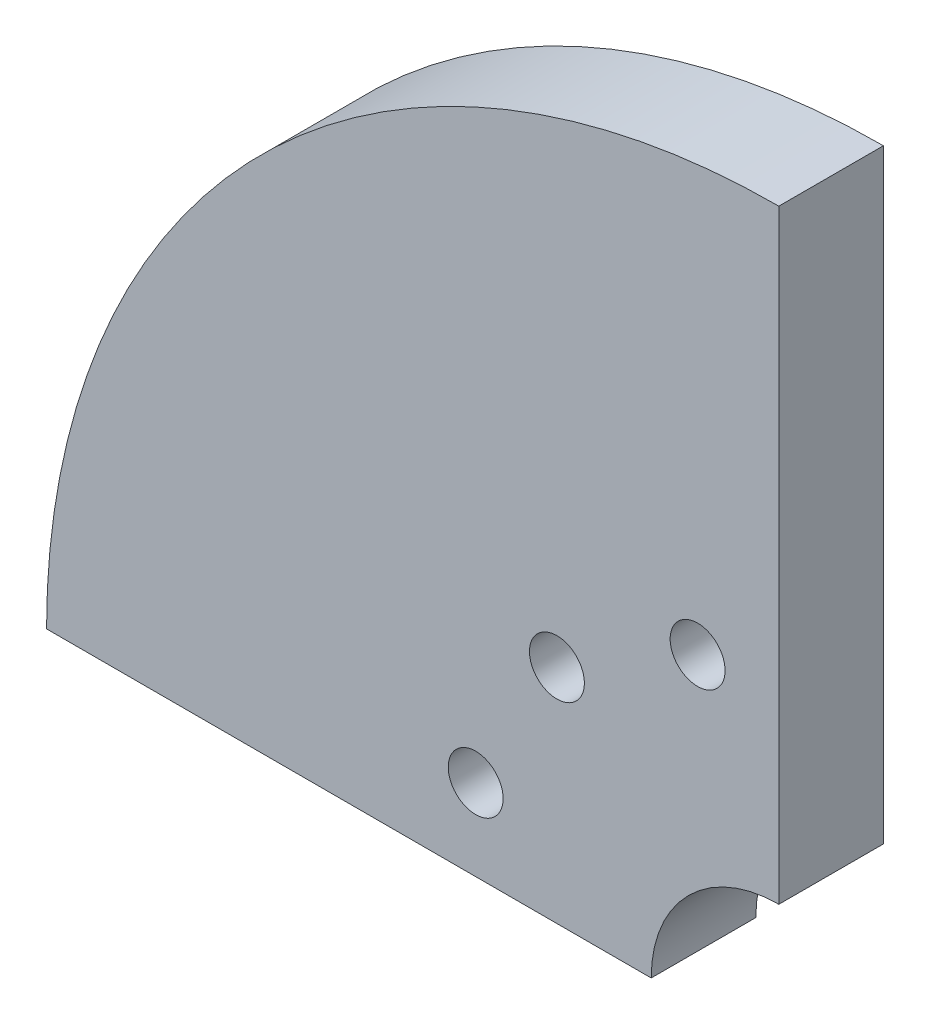
ISO-10303-21;
HEADER;
FILE_DESCRIPTION(('STEP AP214'),'2;1');
FILE_NAME('part.step','',(''),(''),'','','');
FILE_SCHEMA(('AUTOMOTIVE_DESIGN { 1 0 10303 214 1 1 1 1 }'));
ENDSEC;
DATA;
#1=APPLICATION_CONTEXT('core data for automotive mechanical design processes');
#2=APPLICATION_PROTOCOL_DEFINITION('international standard','automotive_design',2000,#1);
#3=PRODUCT_CONTEXT('',#1,'mechanical');
#4=PRODUCT('Part','Part','',(#3));
#5=PRODUCT_RELATED_PRODUCT_CATEGORY('part','',(#4));
#6=PRODUCT_DEFINITION_FORMATION('','',#4);
#7=PRODUCT_DEFINITION_CONTEXT('part definition',#1,'design');
#8=PRODUCT_DEFINITION('design','',#6,#7);
#9=PRODUCT_DEFINITION_SHAPE('','',#8);
#10=(LENGTH_UNIT() NAMED_UNIT(*) SI_UNIT(.MILLI.,.METRE.));
#11=(NAMED_UNIT(*) PLANE_ANGLE_UNIT() SI_UNIT($,.RADIAN.));
#12=(NAMED_UNIT(*) SI_UNIT($,.STERADIAN.) SOLID_ANGLE_UNIT());
#13=UNCERTAINTY_MEASURE_WITH_UNIT(LENGTH_MEASURE(1.E-05),#10,'distance_accuracy_value','');
#14=(GEOMETRIC_REPRESENTATION_CONTEXT(3) GLOBAL_UNCERTAINTY_ASSIGNED_CONTEXT((#13)) GLOBAL_UNIT_ASSIGNED_CONTEXT((#10,
#11,#12)) REPRESENTATION_CONTEXT('',''));
#15=CARTESIAN_POINT('',(0.,0.,0.));
#16=DIRECTION('',(0.,0.,1.));
#17=DIRECTION('',(1.,0.,0.));
#18=AXIS2_PLACEMENT_3D('',#15,#16,#17);
#19=CARTESIAN_POINT('',(0.,0.,10.));
#20=DIRECTION('',(0.,1.,0.));
#21=DIRECTION('',(-1.,0.,0.));
#22=AXIS2_PLACEMENT_3D('',#19,#20,#21);
#23=PLANE('',#22);
#24=DIRECTION('',(0.,0.,-1.));
#25=VECTOR('',#24,1.);
#26=CARTESIAN_POINT('',(-12.2,0.,20.));
#27=LINE('',#26,#25);
#28=CARTESIAN_POINT('',(-12.2,0.,10.));
#29=VERTEX_POINT('',#28);
#30=CARTESIAN_POINT('',(-12.2,0.,0.));
#31=VERTEX_POINT('',#30);
#32=EDGE_CURVE('E297',#29,#31,#27,.T.);
#33=ORIENTED_EDGE('',*,*,#32,.F.);
#34=DIRECTION('',(1.,0.,0.));
#35=VECTOR('',#34,1.);
#36=CARTESIAN_POINT('',(0.,0.,10.));
#37=LINE('',#36,#35);
#38=CARTESIAN_POINT('',(-69.9999999995403,0.,10.));
#39=VERTEX_POINT('',#38);
#40=EDGE_CURVE('E321',#39,#29,#37,.T.);
#41=ORIENTED_EDGE('',*,*,#40,.F.);
#42=DIRECTION('',(0.,0.,-1.));
#43=VECTOR('',#42,1.);
#44=CARTESIAN_POINT('',(-69.9999999995403,0.,10.));
#45=LINE('',#44,#43);
#46=CARTESIAN_POINT('',(-69.9999999995403,0.,0.));
#47=VERTEX_POINT('',#46);
#48=EDGE_CURVE('E12',#39,#47,#45,.T.);
#49=ORIENTED_EDGE('',*,*,#48,.T.);
#50=DIRECTION('',(1.,0.,0.));
#51=VECTOR('',#50,1.);
#52=CARTESIAN_POINT('',(0.,0.,0.));
#53=LINE('',#52,#51);
#54=EDGE_CURVE('E329',#47,#31,#53,.T.);
#55=ORIENTED_EDGE('',*,*,#54,.T.);
#56=EDGE_LOOP('',(#33,#41,#49,#55));
#57=FACE_BOUND('',#56,.T.);
#58=ADVANCED_FACE('F84',(#57),#23,.F.);
#59=CARTESIAN_POINT('',(0.,69.9999999997537,10.));
#60=DIRECTION('',(-1.,0.,0.));
#61=DIRECTION('',(0.,-1.,0.));
#62=AXIS2_PLACEMENT_3D('',#59,#60,#61);
#63=PLANE('',#62);
#64=DIRECTION('',(0.,0.,-1.));
#65=VECTOR('',#64,1.);
#66=CARTESIAN_POINT('',(0.,12.2,20.));
#67=LINE('',#66,#65);
#68=CARTESIAN_POINT('',(0.,12.2,0.));
#69=VERTEX_POINT('',#68);
#70=CARTESIAN_POINT('',(0.,12.2,10.));
#71=VERTEX_POINT('',#70);
#72=EDGE_CURVE('E295',#69,#71,#67,.F.);
#73=ORIENTED_EDGE('',*,*,#72,.F.);
#74=DIRECTION('',(0.,1.,0.));
#75=VECTOR('',#74,1.);
#76=CARTESIAN_POINT('',(0.,69.9999999997537,0.));
#77=LINE('',#76,#75);
#78=CARTESIAN_POINT('',(0.,69.9999999997537,0.));
#79=VERTEX_POINT('',#78);
#80=EDGE_CURVE('E322',#69,#79,#77,.T.);
#81=ORIENTED_EDGE('',*,*,#80,.T.);
#82=DIRECTION('',(0.,0.,-1.));
#83=VECTOR('',#82,1.);
#84=CARTESIAN_POINT('',(0.,69.9999999997537,10.));
#85=LINE('',#84,#83);
#86=CARTESIAN_POINT('',(0.,69.9999999997537,10.));
#87=VERTEX_POINT('',#86);
#88=EDGE_CURVE('E92',#87,#79,#85,.T.);
#89=ORIENTED_EDGE('',*,*,#88,.F.);
#90=DIRECTION('',(0.,1.,0.));
#91=VECTOR('',#90,1.);
#92=CARTESIAN_POINT('',(0.,69.9999999997537,10.));
#93=LINE('',#92,#91);
#94=EDGE_CURVE('E325',#71,#87,#93,.T.);
#95=ORIENTED_EDGE('',*,*,#94,.F.);
#96=EDGE_LOOP('',(#73,#81,#89,#95));
#97=FACE_BOUND('',#96,.T.);
#98=ADVANCED_FACE('F348',(#97),#63,.F.);
#99=CARTESIAN_POINT('',(4.59764150087056E-10,-2.46261344649667E-10,10.));
#100=DIRECTION('',(0.,0.,-1.));
#101=DIRECTION('',(-1.,0.,0.));
#102=AXIS2_PLACEMENT_3D('',#99,#100,#101);
#103=CYLINDRICAL_SURFACE('',#102,70.);
#104=CARTESIAN_POINT('',(4.59764150087056E-10,-2.46261344649667E-10,0.));
#105=DIRECTION('',(0.,0.,1.));
#106=DIRECTION('',(1.,0.,0.));
#107=AXIS2_PLACEMENT_3D('',#104,#105,#106);
#108=CIRCLE('',#107,70.);
#109=EDGE_CURVE('E303',#79,#47,#108,.T.);
#110=ORIENTED_EDGE('',*,*,#109,.T.);
#111=ORIENTED_EDGE('',*,*,#48,.F.);
#112=CARTESIAN_POINT('',(4.59764150087056E-10,-2.46261344649667E-10,10.));
#113=DIRECTION('',(0.,0.,1.));
#114=DIRECTION('',(1.,0.,0.));
#115=AXIS2_PLACEMENT_3D('',#112,#113,#114);
#116=CIRCLE('',#115,70.);
#117=EDGE_CURVE('E318',#87,#39,#116,.T.);
#118=ORIENTED_EDGE('',*,*,#117,.F.);
#119=ORIENTED_EDGE('',*,*,#88,.T.);
#120=EDGE_LOOP('',(#110,#111,#118,#119));
#121=FACE_BOUND('',#120,.T.);
#122=ADVANCED_FACE('F86',(#121),#103,.T.);
#123=CARTESIAN_POINT('',(4.59764150087056E-10,-2.46261344649667E-10,10.));
#124=DIRECTION('',(0.,0.,1.));
#125=DIRECTION('',(1.,0.,0.));
#126=AXIS2_PLACEMENT_3D('',#123,#124,#125);
#127=PLANE('',#126);
#128=CARTESIAN_POINT('',(-7.76457135,28.97777479,10.));
#129=DIRECTION('',(0.,0.,1.));
#130=DIRECTION('',(1.,0.,0.));
#131=AXIS2_PLACEMENT_3D('',#128,#129,#130);
#132=CIRCLE('',#131,2.625);
#133=CARTESIAN_POINT('',(-5.13957135,28.97777479,10.));
#134=VERTEX_POINT('',#133);
#135=EDGE_CURVE('E300',#134,#134,#132,.T.);
#136=ORIENTED_EDGE('',*,*,#135,.F.);
#137=EDGE_LOOP('',(#136));
#138=FACE_BOUND('',#137,.T.);
#139=CARTESIAN_POINT('',(-21.2132034335958,21.2132034382832,10.));
#140=DIRECTION('',(0.,0.,1.));
#141=DIRECTION('',(1.,0.,0.));
#142=AXIS2_PLACEMENT_3D('',#139,#140,#141);
#143=CIRCLE('',#142,2.62500000000006);
#144=CARTESIAN_POINT('',(-18.5882034335958,21.2132034382832,10.));
#145=VERTEX_POINT('',#144);
#146=EDGE_CURVE('E307',#145,#145,#143,.T.);
#147=ORIENTED_EDGE('',*,*,#146,.F.);
#148=EDGE_LOOP('',(#147));
#149=FACE_BOUND('',#148,.T.);
#150=CARTESIAN_POINT('',(-28.977774788282,7.76457135640176,10.));
#151=DIRECTION('',(0.,0.,1.));
#152=DIRECTION('',(1.,0.,0.));
#153=AXIS2_PLACEMENT_3D('',#150,#151,#152);
#154=CIRCLE('',#153,2.62500000000078);
#155=CARTESIAN_POINT('',(-26.3527747882812,7.76457135640176,10.));
#156=VERTEX_POINT('',#155);
#157=EDGE_CURVE('E313',#156,#156,#154,.T.);
#158=ORIENTED_EDGE('',*,*,#157,.F.);
#159=EDGE_LOOP('',(#158));
#160=FACE_BOUND('',#159,.T.);
#161=ORIENTED_EDGE('',*,*,#40,.T.);
#162=CARTESIAN_POINT('',(0.,0.,10.));
#163=DIRECTION('',(0.,0.,1.));
#164=DIRECTION('',(1.,0.,0.));
#165=AXIS2_PLACEMENT_3D('',#162,#163,#164);
#166=CIRCLE('',#165,12.2);
#167=EDGE_CURVE('E292',#29,#71,#166,.F.);
#168=ORIENTED_EDGE('',*,*,#167,.T.);
#169=ORIENTED_EDGE('',*,*,#94,.T.);
#170=ORIENTED_EDGE('',*,*,#117,.T.);
#171=EDGE_LOOP('',(#161,#168,#169,#170));
#172=FACE_BOUND('',#171,.T.);
#173=ADVANCED_FACE('F346',(#138,#149,#160,#172),#127,.T.);
#174=CARTESIAN_POINT('',(4.59764150087056E-10,-2.46261344649667E-10,0.));
#175=DIRECTION('',(0.,0.,1.));
#176=DIRECTION('',(1.,0.,0.));
#177=AXIS2_PLACEMENT_3D('',#174,#175,#176);
#178=PLANE('',#177);
#179=DIRECTION('',(-0.965925826289067,0.258819045102525,0.));
#180=VECTOR('',#179,1.);
#181=CARTESIAN_POINT('',(-37.314667526362,1.7246088570735,0.));
#182=LINE('',#181,#180);
#183=CARTESIAN_POINT('',(-37.314667526362,1.7246088570735,0.));
#184=VERTEX_POINT('',#183);
#185=CARTESIAN_POINT('',(-58.5650357047215,7.41862784932904,0.));
#186=VERTEX_POINT('',#185);
#187=EDGE_CURVE('E250',#184,#186,#182,.T.);
#188=ORIENTED_EDGE('',*,*,#187,.F.);
#189=DIRECTION('',(-0.258819045102525,-0.965925826289067,0.));
#190=VECTOR('',#189,1.);
#191=CARTESIAN_POINT('',(-33.1735628047216,17.1794220776986,0.));
#192=LINE('',#191,#190);
#193=CARTESIAN_POINT('',(-33.1735628047216,17.1794220776986,0.));
#194=VERTEX_POINT('',#193);
#195=EDGE_CURVE('E99',#194,#184,#192,.T.);
#196=ORIENTED_EDGE('',*,*,#195,.F.);
#197=DIRECTION('',(-0.965925826289067,0.258819045102525,0.));
#198=VECTOR('',#197,1.);
#199=CARTESIAN_POINT('',(-33.1735628047216,17.1794220776986,0.));
#200=LINE('',#199,#198);
#201=CARTESIAN_POINT('',(-54.4239309830811,22.8734410699541,0.));
#202=VERTEX_POINT('',#201);
#203=EDGE_CURVE('E243',#194,#202,#200,.T.);
#204=ORIENTED_EDGE('',*,*,#203,.T.);
#205=DIRECTION('',(-0.258819045102525,-0.965925826289067,0.));
#206=VECTOR('',#205,1.);
#207=CARTESIAN_POINT('',(-54.4239309830811,22.8734410699541,0.));
#208=LINE('',#207,#206);
#209=EDGE_CURVE('E246',#202,#186,#208,.T.);
#210=ORIENTED_EDGE('',*,*,#209,.T.);
#211=EDGE_LOOP('',(#188,#196,#204,#210));
#212=FACE_BOUND('',#211,.T.);
#213=DIRECTION('',(-0.258819045102521,0.965925826289068,0.));
#214=VECTOR('',#213,1.);
#215=CARTESIAN_POINT('',(-17.1637786813638,33.1777544401385,0.));
#216=LINE('',#215,#214);
#217=CARTESIAN_POINT('',(-17.1637786813638,33.1777544401385,0.));
#218=VERTEX_POINT('',#217);
#219=CARTESIAN_POINT('',(-22.8577976736192,54.428122618498,0.));
#220=VERTEX_POINT('',#219);
#221=EDGE_CURVE('E217',#218,#220,#216,.T.);
#222=ORIENTED_EDGE('',*,*,#221,.F.);
#223=DIRECTION('',(-0.965925826289068,-0.258819045102521,0.));
#224=VECTOR('',#223,1.);
#225=CARTESIAN_POINT('',(-1.70896546073868,37.3188591617789,0.));
#226=LINE('',#225,#224);
#227=CARTESIAN_POINT('',(-1.70896546073868,37.3188591617789,0.));
#228=VERTEX_POINT('',#227);
#229=EDGE_CURVE('E107',#228,#218,#226,.T.);
#230=ORIENTED_EDGE('',*,*,#229,.F.);
#231=DIRECTION('',(-0.258819045102521,0.965925826289068,0.));
#232=VECTOR('',#231,1.);
#233=CARTESIAN_POINT('',(-1.70896546073868,37.3188591617789,0.));
#234=LINE('',#233,#232);
#235=CARTESIAN_POINT('',(-7.40298445299415,58.5692273401384,0.));
#236=VERTEX_POINT('',#235);
#237=EDGE_CURVE('E205',#228,#236,#234,.T.);
#238=ORIENTED_EDGE('',*,*,#237,.T.);
#239=DIRECTION('',(-0.965925826289068,-0.258819045102522,0.));
#240=VECTOR('',#239,1.);
#241=CARTESIAN_POINT('',(-7.40298445299415,58.5692273401384,0.));
#242=LINE('',#241,#240);
#243=EDGE_CURVE('E211',#236,#220,#242,.T.);
#244=ORIENTED_EDGE('',*,*,#243,.T.);
#245=EDGE_LOOP('',(#222,#230,#238,#244));
#246=FACE_BOUND('',#245,.T.);
#247=DIRECTION('',(-0.707106781186546,0.707106781186549,0.));
#248=VECTOR('',#247,1.);
#249=CARTESIAN_POINT('',(-31.4531455830633,20.1508888449993,0.));
#250=LINE('',#249,#248);
#251=CARTESIAN_POINT('',(-31.4531455830633,20.1508888449993,0.));
#252=VERTEX_POINT('',#251);
#253=CARTESIAN_POINT('',(-47.0094947691673,35.7072380311034,0.));
#254=VERTEX_POINT('',#253);
#255=EDGE_CURVE('E220',#252,#254,#250,.T.);
#256=ORIENTED_EDGE('',*,*,#255,.F.);
#257=DIRECTION('',(-0.707106781186548,-0.707106781186547,0.));
#258=VECTOR('',#257,1.);
#259=CARTESIAN_POINT('',(-20.1394370840785,31.4645973439841,0.));
#260=LINE('',#259,#258);
#261=CARTESIAN_POINT('',(-20.1394370840785,31.4645973439841,0.));
#262=VERTEX_POINT('',#261);
#263=EDGE_CURVE('E218',#262,#252,#260,.T.);
#264=ORIENTED_EDGE('',*,*,#263,.F.);
#265=DIRECTION('',(-0.707106781186547,0.707106781186549,0.));
#266=VECTOR('',#265,1.);
#267=CARTESIAN_POINT('',(-20.1394370840785,31.4645973439841,0.));
#268=LINE('',#267,#266);
#269=CARTESIAN_POINT('',(-35.6957862701825,47.0209465300881,0.));
#270=VERTEX_POINT('',#269);
#271=EDGE_CURVE('E266',#262,#270,#268,.T.);
#272=ORIENTED_EDGE('',*,*,#271,.T.);
#273=DIRECTION('',(-0.707106781186548,-0.707106781186547,0.));
#274=VECTOR('',#273,1.);
#275=CARTESIAN_POINT('',(-35.6957862701825,47.0209465300881,0.));
#276=LINE('',#275,#274);
#277=EDGE_CURVE('E276',#270,#254,#276,.T.);
#278=ORIENTED_EDGE('',*,*,#277,.T.);
#279=EDGE_LOOP('',(#256,#264,#272,#278));
#280=FACE_BOUND('',#279,.T.);
#281=CARTESIAN_POINT('',(0.,0.,0.));
#282=DIRECTION('',(0.,0.,1.));
#283=DIRECTION('',(1.,0.,0.));
#284=AXIS2_PLACEMENT_3D('',#281,#282,#283);
#285=CIRCLE('',#284,12.2);
#286=EDGE_CURVE('E283',#69,#31,#285,.T.);
#287=ORIENTED_EDGE('',*,*,#286,.T.);
#288=ORIENTED_EDGE('',*,*,#54,.F.);
#289=ORIENTED_EDGE('',*,*,#109,.F.);
#290=ORIENTED_EDGE('',*,*,#80,.F.);
#291=EDGE_LOOP('',(#287,#288,#289,#290));
#292=FACE_BOUND('',#291,.T.);
#293=CARTESIAN_POINT('',(-7.76457135,28.97777479,0.));
#294=DIRECTION('',(0.,0.,1.));
#295=DIRECTION('',(1.,0.,0.));
#296=AXIS2_PLACEMENT_3D('',#293,#294,#295);
#297=CIRCLE('',#296,2.625);
#298=CARTESIAN_POINT('',(-5.13957135,28.97777479,0.));
#299=VERTEX_POINT('',#298);
#300=EDGE_CURVE('E304',#299,#299,#297,.T.);
#301=ORIENTED_EDGE('',*,*,#300,.T.);
#302=EDGE_LOOP('',(#301));
#303=FACE_BOUND('',#302,.T.);
#304=CARTESIAN_POINT('',(-21.2132034335958,21.2132034382832,0.));
#305=DIRECTION('',(0.,0.,1.));
#306=DIRECTION('',(1.,0.,0.));
#307=AXIS2_PLACEMENT_3D('',#304,#305,#306);
#308=CIRCLE('',#307,2.62500000000006);
#309=CARTESIAN_POINT('',(-18.5882034335958,21.2132034382832,0.));
#310=VERTEX_POINT('',#309);
#311=EDGE_CURVE('E310',#310,#310,#308,.T.);
#312=ORIENTED_EDGE('',*,*,#311,.T.);
#313=EDGE_LOOP('',(#312));
#314=FACE_BOUND('',#313,.T.);
#315=CARTESIAN_POINT('',(-28.977774788282,7.76457135640176,0.));
#316=DIRECTION('',(0.,0.,1.));
#317=DIRECTION('',(1.,0.,0.));
#318=AXIS2_PLACEMENT_3D('',#315,#316,#317);
#319=CIRCLE('',#318,2.62500000000078);
#320=CARTESIAN_POINT('',(-26.3527747882812,7.76457135640176,0.));
#321=VERTEX_POINT('',#320);
#322=EDGE_CURVE('E299',#321,#321,#319,.T.);
#323=ORIENTED_EDGE('',*,*,#322,.T.);
#324=EDGE_LOOP('',(#323));
#325=FACE_BOUND('',#324,.T.);
#326=ADVANCED_FACE('F214',(#212,#246,#280,#292,#303,#314,#325),#178,.F.);
#327=CARTESIAN_POINT('',(-28.977774788282,7.76457135640176,10.));
#328=DIRECTION('',(0.,0.,-1.));
#329=DIRECTION('',(-1.,0.,0.));
#330=AXIS2_PLACEMENT_3D('',#327,#328,#329);
#331=CYLINDRICAL_SURFACE('',#330,2.62500000000078);
#332=ORIENTED_EDGE('',*,*,#157,.T.);
#333=EDGE_LOOP('',(#332));
#334=FACE_BOUND('',#333,.T.);
#335=ORIENTED_EDGE('',*,*,#322,.F.);
#336=EDGE_LOOP('',(#335));
#337=FACE_BOUND('',#336,.T.);
#338=ADVANCED_FACE('F373',(#334,#337),#331,.F.);
#339=CARTESIAN_POINT('',(-21.2132034335958,21.2132034382832,10.));
#340=DIRECTION('',(0.,0.,-1.));
#341=DIRECTION('',(-1.,0.,0.));
#342=AXIS2_PLACEMENT_3D('',#339,#340,#341);
#343=CYLINDRICAL_SURFACE('',#342,2.62500000000006);
#344=ORIENTED_EDGE('',*,*,#146,.T.);
#345=EDGE_LOOP('',(#344));
#346=FACE_BOUND('',#345,.T.);
#347=ORIENTED_EDGE('',*,*,#311,.F.);
#348=EDGE_LOOP('',(#347));
#349=FACE_BOUND('',#348,.T.);
#350=ADVANCED_FACE('F362',(#346,#349),#343,.F.);
#351=CARTESIAN_POINT('',(-7.76457135,28.97777479,10.));
#352=DIRECTION('',(0.,0.,-1.));
#353=DIRECTION('',(-1.,0.,0.));
#354=AXIS2_PLACEMENT_3D('',#351,#352,#353);
#355=CYLINDRICAL_SURFACE('',#354,2.625);
#356=ORIENTED_EDGE('',*,*,#135,.T.);
#357=EDGE_LOOP('',(#356));
#358=FACE_BOUND('',#357,.T.);
#359=ORIENTED_EDGE('',*,*,#300,.F.);
#360=EDGE_LOOP('',(#359));
#361=FACE_BOUND('',#360,.T.);
#362=ADVANCED_FACE('F353',(#358,#361),#355,.F.);
#363=CARTESIAN_POINT('',(0.,0.,20.));
#364=DIRECTION('',(0.,0.,-1.));
#365=DIRECTION('',(-1.,0.,0.));
#366=AXIS2_PLACEMENT_3D('',#363,#364,#365);
#367=CYLINDRICAL_SURFACE('',#366,12.2);
#368=ORIENTED_EDGE('',*,*,#32,.T.);
#369=ORIENTED_EDGE('',*,*,#286,.F.);
#370=ORIENTED_EDGE('',*,*,#72,.T.);
#371=ORIENTED_EDGE('',*,*,#167,.F.);
#372=EDGE_LOOP('',(#368,#369,#370,#371));
#373=FACE_BOUND('',#372,.T.);
#374=ADVANCED_FACE('F350',(#373),#367,.F.);
#375=CARTESIAN_POINT('',(-20.1394370840785,31.4645973439841,4.));
#376=DIRECTION('',(0.707106781186547,-0.707106781186548,0.));
#377=DIRECTION('',(0.707106781186548,0.707106781186547,0.));
#378=AXIS2_PLACEMENT_3D('',#375,#376,#377);
#379=PLANE('',#378);
#380=ORIENTED_EDGE('',*,*,#263,.T.);
#381=DIRECTION('',(0.,0.,-1.));
#382=VECTOR('',#381,1.);
#383=CARTESIAN_POINT('',(-31.4531455830633,20.1508888449993,4.));
#384=LINE('',#383,#382);
#385=CARTESIAN_POINT('',(-31.4531455830633,20.1508888449993,4.));
#386=VERTEX_POINT('',#385);
#387=EDGE_CURVE('E272',#386,#252,#384,.T.);
#388=ORIENTED_EDGE('',*,*,#387,.F.);
#389=DIRECTION('',(-0.707106781186548,-0.707106781186547,0.));
#390=VECTOR('',#389,1.);
#391=CARTESIAN_POINT('',(-20.1394370840785,31.4645973439841,4.));
#392=LINE('',#391,#390);
#393=CARTESIAN_POINT('',(-20.1394370840785,31.4645973439841,4.));
#394=VERTEX_POINT('',#393);
#395=EDGE_CURVE('E262',#394,#386,#392,.T.);
#396=ORIENTED_EDGE('',*,*,#395,.F.);
#397=DIRECTION('',(0.,0.,-1.));
#398=VECTOR('',#397,1.);
#399=CARTESIAN_POINT('',(-20.1394370840785,31.4645973439841,4.));
#400=LINE('',#399,#398);
#401=EDGE_CURVE('E281',#394,#262,#400,.T.);
#402=ORIENTED_EDGE('',*,*,#401,.T.);
#403=EDGE_LOOP('',(#380,#388,#396,#402));
#404=FACE_BOUND('',#403,.T.);
#405=ADVANCED_FACE('F352',(#404),#379,.F.);
#406=CARTESIAN_POINT('',(-20.1394370840785,31.4645973439841,4.));
#407=DIRECTION('',(-0.707106781186549,-0.707106781186547,0.));
#408=DIRECTION('',(0.707106781186547,-0.707106781186549,0.));
#409=AXIS2_PLACEMENT_3D('',#406,#407,#408);
#410=PLANE('',#409);
#411=ORIENTED_EDGE('',*,*,#271,.F.);
#412=ORIENTED_EDGE('',*,*,#401,.F.);
#413=DIRECTION('',(-0.707106781186547,0.707106781186549,0.));
#414=VECTOR('',#413,1.);
#415=CARTESIAN_POINT('',(-20.1394370840785,31.4645973439841,4.));
#416=LINE('',#415,#414);
#417=CARTESIAN_POINT('',(-35.6957862701825,47.0209465300881,4.));
#418=VERTEX_POINT('',#417);
#419=EDGE_CURVE('E271',#394,#418,#416,.T.);
#420=ORIENTED_EDGE('',*,*,#419,.T.);
#421=DIRECTION('',(0.,0.,-1.));
#422=VECTOR('',#421,1.);
#423=CARTESIAN_POINT('',(-35.6957862701825,47.0209465300881,4.));
#424=LINE('',#423,#422);
#425=EDGE_CURVE('E284',#418,#270,#424,.T.);
#426=ORIENTED_EDGE('',*,*,#425,.T.);
#427=EDGE_LOOP('',(#411,#412,#420,#426));
#428=FACE_BOUND('',#427,.T.);
#429=ADVANCED_FACE('F359',(#428),#410,.T.);
#430=CARTESIAN_POINT('',(-35.6957862701825,47.0209465300881,4.));
#431=DIRECTION('',(0.707106781186547,-0.707106781186548,0.));
#432=DIRECTION('',(0.707106781186548,0.707106781186547,0.));
#433=AXIS2_PLACEMENT_3D('',#430,#431,#432);
#434=PLANE('',#433);
#435=ORIENTED_EDGE('',*,*,#277,.F.);
#436=ORIENTED_EDGE('',*,*,#425,.F.);
#437=DIRECTION('',(-0.707106781186548,-0.707106781186547,0.));
#438=VECTOR('',#437,1.);
#439=CARTESIAN_POINT('',(-35.6957862701825,47.0209465300881,4.));
#440=LINE('',#439,#438);
#441=CARTESIAN_POINT('',(-47.0094947691673,35.7072380311034,4.));
#442=VERTEX_POINT('',#441);
#443=EDGE_CURVE('E269',#418,#442,#440,.T.);
#444=ORIENTED_EDGE('',*,*,#443,.T.);
#445=DIRECTION('',(0.,0.,-1.));
#446=VECTOR('',#445,1.);
#447=CARTESIAN_POINT('',(-47.0094947691673,35.7072380311034,4.));
#448=LINE('',#447,#446);
#449=EDGE_CURVE('E286',#442,#254,#448,.T.);
#450=ORIENTED_EDGE('',*,*,#449,.T.);
#451=EDGE_LOOP('',(#435,#436,#444,#450));
#452=FACE_BOUND('',#451,.T.);
#453=ADVANCED_FACE('F445',(#452),#434,.T.);
#454=CARTESIAN_POINT('',(-31.4531455830633,20.1508888449993,4.));
#455=DIRECTION('',(-0.707106781186549,-0.707106781186546,0.));
#456=DIRECTION('',(0.707106781186546,-0.707106781186549,0.));
#457=AXIS2_PLACEMENT_3D('',#454,#455,#456);
#458=PLANE('',#457);
#459=ORIENTED_EDGE('',*,*,#255,.T.);
#460=ORIENTED_EDGE('',*,*,#449,.F.);
#461=DIRECTION('',(-0.707106781186546,0.707106781186549,0.));
#462=VECTOR('',#461,1.);
#463=CARTESIAN_POINT('',(-31.4531455830633,20.1508888449993,4.));
#464=LINE('',#463,#462);
#465=EDGE_CURVE('E265',#386,#442,#464,.T.);
#466=ORIENTED_EDGE('',*,*,#465,.F.);
#467=ORIENTED_EDGE('',*,*,#387,.T.);
#468=EDGE_LOOP('',(#459,#460,#466,#467));
#469=FACE_BOUND('',#468,.T.);
#470=ADVANCED_FACE('F455',(#469),#458,.F.);
#471=CARTESIAN_POINT('',(0.,0.,4.));
#472=DIRECTION('',(0.,0.,-1.));
#473=DIRECTION('',(-1.,0.,0.));
#474=AXIS2_PLACEMENT_3D('',#471,#472,#473);
#475=PLANE('',#474);
#476=ORIENTED_EDGE('',*,*,#395,.T.);
#477=ORIENTED_EDGE('',*,*,#465,.T.);
#478=ORIENTED_EDGE('',*,*,#443,.F.);
#479=ORIENTED_EDGE('',*,*,#419,.F.);
#480=EDGE_LOOP('',(#476,#477,#478,#479));
#481=FACE_BOUND('',#480,.T.);
#482=ADVANCED_FACE('F465',(#481),#475,.T.);
#483=CARTESIAN_POINT('',(-1.70896546073868,37.3188591617789,4.));
#484=DIRECTION('',(0.258819045102521,-0.965925826289068,0.));
#485=DIRECTION('',(0.965925826289068,0.258819045102521,0.));
#486=AXIS2_PLACEMENT_3D('',#483,#484,#485);
#487=PLANE('',#486);
#488=ORIENTED_EDGE('',*,*,#229,.T.);
#489=DIRECTION('',(0.,0.,-1.));
#490=VECTOR('',#489,1.);
#491=CARTESIAN_POINT('',(-17.1637786813638,33.1777544401385,4.));
#492=LINE('',#491,#490);
#493=CARTESIAN_POINT('',(-17.1637786813638,33.1777544401385,4.));
#494=VERTEX_POINT('',#493);
#495=EDGE_CURVE('E228',#494,#218,#492,.T.);
#496=ORIENTED_EDGE('',*,*,#495,.F.);
#497=DIRECTION('',(-0.965925826289068,-0.258819045102521,0.));
#498=VECTOR('',#497,1.);
#499=CARTESIAN_POINT('',(-1.70896546073868,37.3188591617789,4.));
#500=LINE('',#499,#498);
#501=CARTESIAN_POINT('',(-1.70896546073868,37.3188591617789,4.));
#502=VERTEX_POINT('',#501);
#503=EDGE_CURVE('E199',#502,#494,#500,.T.);
#504=ORIENTED_EDGE('',*,*,#503,.F.);
#505=DIRECTION('',(0.,0.,-1.));
#506=VECTOR('',#505,1.);
#507=CARTESIAN_POINT('',(-1.70896546073868,37.3188591617789,4.));
#508=LINE('',#507,#506);
#509=EDGE_CURVE('E195',#502,#228,#508,.T.);
#510=ORIENTED_EDGE('',*,*,#509,.T.);
#511=EDGE_LOOP('',(#488,#496,#504,#510));
#512=FACE_BOUND('',#511,.T.);
#513=ADVANCED_FACE('F197',(#512),#487,.F.);
#514=CARTESIAN_POINT('',(-1.70896546073868,37.3188591617789,4.));
#515=DIRECTION('',(-0.965925826289068,-0.258819045102521,0.));
#516=DIRECTION('',(0.258819045102521,-0.965925826289068,0.));
#517=AXIS2_PLACEMENT_3D('',#514,#515,#516);
#518=PLANE('',#517);
#519=ORIENTED_EDGE('',*,*,#237,.F.);
#520=ORIENTED_EDGE('',*,*,#509,.F.);
#521=DIRECTION('',(-0.258819045102521,0.965925826289068,0.));
#522=VECTOR('',#521,1.);
#523=CARTESIAN_POINT('',(-1.70896546073868,37.3188591617789,4.));
#524=LINE('',#523,#522);
#525=CARTESIAN_POINT('',(-7.40298445299415,58.5692273401384,4.));
#526=VERTEX_POINT('',#525);
#527=EDGE_CURVE('E225',#502,#526,#524,.T.);
#528=ORIENTED_EDGE('',*,*,#527,.T.);
#529=DIRECTION('',(0.,0.,-1.));
#530=VECTOR('',#529,1.);
#531=CARTESIAN_POINT('',(-7.40298445299415,58.5692273401384,4.));
#532=LINE('',#531,#530);
#533=EDGE_CURVE('E202',#526,#236,#532,.T.);
#534=ORIENTED_EDGE('',*,*,#533,.T.);
#535=EDGE_LOOP('',(#519,#520,#528,#534));
#536=FACE_BOUND('',#535,.T.);
#537=ADVANCED_FACE('F206',(#536),#518,.T.);
#538=CARTESIAN_POINT('',(-7.40298445299415,58.5692273401384,4.));
#539=DIRECTION('',(0.258819045102522,-0.965925826289068,0.));
#540=DIRECTION('',(0.965925826289068,0.258819045102522,0.));
#541=AXIS2_PLACEMENT_3D('',#538,#539,#540);
#542=PLANE('',#541);
#543=ORIENTED_EDGE('',*,*,#243,.F.);
#544=ORIENTED_EDGE('',*,*,#533,.F.);
#545=DIRECTION('',(-0.965925826289068,-0.258819045102522,0.));
#546=VECTOR('',#545,1.);
#547=CARTESIAN_POINT('',(-7.40298445299415,58.5692273401384,4.));
#548=LINE('',#547,#546);
#549=CARTESIAN_POINT('',(-22.8577976736192,54.428122618498,4.));
#550=VERTEX_POINT('',#549);
#551=EDGE_CURVE('E227',#526,#550,#548,.T.);
#552=ORIENTED_EDGE('',*,*,#551,.T.);
#553=DIRECTION('',(0.,0.,-1.));
#554=VECTOR('',#553,1.);
#555=CARTESIAN_POINT('',(-22.8577976736192,54.428122618498,4.));
#556=LINE('',#555,#554);
#557=EDGE_CURVE('E586',#550,#220,#556,.T.);
#558=ORIENTED_EDGE('',*,*,#557,.T.);
#559=EDGE_LOOP('',(#543,#544,#552,#558));
#560=FACE_BOUND('',#559,.T.);
#561=ADVANCED_FACE('F492',(#560),#542,.T.);
#562=CARTESIAN_POINT('',(-17.1637786813638,33.1777544401385,4.));
#563=DIRECTION('',(-0.965925826289068,-0.258819045102521,0.));
#564=DIRECTION('',(0.258819045102521,-0.965925826289068,0.));
#565=AXIS2_PLACEMENT_3D('',#562,#563,#564);
#566=PLANE('',#565);
#567=ORIENTED_EDGE('',*,*,#221,.T.);
#568=ORIENTED_EDGE('',*,*,#557,.F.);
#569=DIRECTION('',(-0.258819045102521,0.965925826289068,0.));
#570=VECTOR('',#569,1.);
#571=CARTESIAN_POINT('',(-17.1637786813638,33.1777544401385,4.));
#572=LINE('',#571,#570);
#573=EDGE_CURVE('E230',#494,#550,#572,.T.);
#574=ORIENTED_EDGE('',*,*,#573,.F.);
#575=ORIENTED_EDGE('',*,*,#495,.T.);
#576=EDGE_LOOP('',(#567,#568,#574,#575));
#577=FACE_BOUND('',#576,.T.);
#578=ADVANCED_FACE('F501',(#577),#566,.F.);
#579=CARTESIAN_POINT('',(0.,0.,4.));
#580=DIRECTION('',(0.,0.,-1.));
#581=DIRECTION('',(-1.,0.,0.));
#582=AXIS2_PLACEMENT_3D('',#579,#580,#581);
#583=PLANE('',#582);
#584=ORIENTED_EDGE('',*,*,#503,.T.);
#585=ORIENTED_EDGE('',*,*,#573,.T.);
#586=ORIENTED_EDGE('',*,*,#551,.F.);
#587=ORIENTED_EDGE('',*,*,#527,.F.);
#588=EDGE_LOOP('',(#584,#585,#586,#587));
#589=FACE_BOUND('',#588,.T.);
#590=ADVANCED_FACE('F511',(#589),#583,.T.);
#591=CARTESIAN_POINT('',(-33.1735628047216,17.1794220776986,4.));
#592=DIRECTION('',(0.965925826289067,-0.258819045102525,0.));
#593=DIRECTION('',(0.258819045102525,0.965925826289067,0.));
#594=AXIS2_PLACEMENT_3D('',#591,#592,#593);
#595=PLANE('',#594);
#596=ORIENTED_EDGE('',*,*,#195,.T.);
#597=DIRECTION('',(0.,0.,-1.));
#598=VECTOR('',#597,1.);
#599=CARTESIAN_POINT('',(-37.314667526362,1.7246088570735,4.));
#600=LINE('',#599,#598);
#601=CARTESIAN_POINT('',(-37.314667526362,1.7246088570735,4.));
#602=VERTEX_POINT('',#601);
#603=EDGE_CURVE('E234',#602,#184,#600,.T.);
#604=ORIENTED_EDGE('',*,*,#603,.F.);
#605=DIRECTION('',(-0.258819045102525,-0.965925826289067,0.));
#606=VECTOR('',#605,1.);
#607=CARTESIAN_POINT('',(-33.1735628047216,17.1794220776986,4.));
#608=LINE('',#607,#606);
#609=CARTESIAN_POINT('',(-33.1735628047216,17.1794220776986,4.));
#610=VERTEX_POINT('',#609);
#611=EDGE_CURVE('E247',#610,#602,#608,.T.);
#612=ORIENTED_EDGE('',*,*,#611,.F.);
#613=DIRECTION('',(0.,0.,-1.));
#614=VECTOR('',#613,1.);
#615=CARTESIAN_POINT('',(-33.1735628047216,17.1794220776986,4.));
#616=LINE('',#615,#614);
#617=EDGE_CURVE('E241',#610,#194,#616,.T.);
#618=ORIENTED_EDGE('',*,*,#617,.T.);
#619=EDGE_LOOP('',(#596,#604,#612,#618));
#620=FACE_BOUND('',#619,.T.);
#621=ADVANCED_FACE('F521',(#620),#595,.F.);
#622=CARTESIAN_POINT('',(-33.1735628047216,17.1794220776986,4.));
#623=DIRECTION('',(-0.258819045102525,-0.965925826289067,0.));
#624=DIRECTION('',(0.965925826289067,-0.258819045102525,0.));
#625=AXIS2_PLACEMENT_3D('',#622,#623,#624);
#626=PLANE('',#625);
#627=ORIENTED_EDGE('',*,*,#203,.F.);
#628=ORIENTED_EDGE('',*,*,#617,.F.);
#629=DIRECTION('',(-0.965925826289067,0.258819045102525,0.));
#630=VECTOR('',#629,1.);
#631=CARTESIAN_POINT('',(-33.1735628047216,17.1794220776986,4.));
#632=LINE('',#631,#630);
#633=CARTESIAN_POINT('',(-54.4239309830811,22.8734410699541,4.));
#634=VERTEX_POINT('',#633);
#635=EDGE_CURVE('E236',#610,#634,#632,.T.);
#636=ORIENTED_EDGE('',*,*,#635,.T.);
#637=DIRECTION('',(0.,0.,-1.));
#638=VECTOR('',#637,1.);
#639=CARTESIAN_POINT('',(-54.4239309830811,22.8734410699541,4.));
#640=LINE('',#639,#638);
#641=EDGE_CURVE('E239',#634,#202,#640,.T.);
#642=ORIENTED_EDGE('',*,*,#641,.T.);
#643=EDGE_LOOP('',(#627,#628,#636,#642));
#644=FACE_BOUND('',#643,.T.);
#645=ADVANCED_FACE('F531',(#644),#626,.T.);
#646=CARTESIAN_POINT('',(-54.4239309830811,22.8734410699541,4.));
#647=DIRECTION('',(0.965925826289067,-0.258819045102525,0.));
#648=DIRECTION('',(0.258819045102525,0.965925826289067,0.));
#649=AXIS2_PLACEMENT_3D('',#646,#647,#648);
#650=PLANE('',#649);
#651=ORIENTED_EDGE('',*,*,#209,.F.);
#652=ORIENTED_EDGE('',*,*,#641,.F.);
#653=DIRECTION('',(-0.258819045102525,-0.965925826289067,0.));
#654=VECTOR('',#653,1.);
#655=CARTESIAN_POINT('',(-54.4239309830811,22.8734410699541,4.));
#656=LINE('',#655,#654);
#657=CARTESIAN_POINT('',(-58.5650357047215,7.41862784932904,4.));
#658=VERTEX_POINT('',#657);
#659=EDGE_CURVE('E255',#634,#658,#656,.T.);
#660=ORIENTED_EDGE('',*,*,#659,.T.);
#661=DIRECTION('',(0.,0.,-1.));
#662=VECTOR('',#661,1.);
#663=CARTESIAN_POINT('',(-58.5650357047215,7.41862784932904,4.));
#664=LINE('',#663,#662);
#665=EDGE_CURVE('E237',#658,#186,#664,.T.);
#666=ORIENTED_EDGE('',*,*,#665,.T.);
#667=EDGE_LOOP('',(#651,#652,#660,#666));
#668=FACE_BOUND('',#667,.T.);
#669=ADVANCED_FACE('F540',(#668),#650,.T.);
#670=CARTESIAN_POINT('',(-37.314667526362,1.7246088570735,4.));
#671=DIRECTION('',(-0.258819045102525,-0.965925826289067,0.));
#672=DIRECTION('',(0.965925826289067,-0.258819045102525,0.));
#673=AXIS2_PLACEMENT_3D('',#670,#671,#672);
#674=PLANE('',#673);
#675=ORIENTED_EDGE('',*,*,#187,.T.);
#676=ORIENTED_EDGE('',*,*,#665,.F.);
#677=DIRECTION('',(-0.965925826289067,0.258819045102525,0.));
#678=VECTOR('',#677,1.);
#679=CARTESIAN_POINT('',(-37.314667526362,1.7246088570735,4.));
#680=LINE('',#679,#678);
#681=EDGE_CURVE('E257',#602,#658,#680,.T.);
#682=ORIENTED_EDGE('',*,*,#681,.F.);
#683=ORIENTED_EDGE('',*,*,#603,.T.);
#684=EDGE_LOOP('',(#675,#676,#682,#683));
#685=FACE_BOUND('',#684,.T.);
#686=ADVANCED_FACE('F550',(#685),#674,.F.);
#687=CARTESIAN_POINT('',(0.,0.,4.));
#688=DIRECTION('',(0.,0.,-1.));
#689=DIRECTION('',(-1.,0.,0.));
#690=AXIS2_PLACEMENT_3D('',#687,#688,#689);
#691=PLANE('',#690);
#692=ORIENTED_EDGE('',*,*,#611,.T.);
#693=ORIENTED_EDGE('',*,*,#681,.T.);
#694=ORIENTED_EDGE('',*,*,#659,.F.);
#695=ORIENTED_EDGE('',*,*,#635,.F.);
#696=EDGE_LOOP('',(#692,#693,#694,#695));
#697=FACE_BOUND('',#696,.T.);
#698=ADVANCED_FACE('F560',(#697),#691,.T.);
#699=CLOSED_SHELL('',(#58,#98,#122,#173,#326,#338,#350,#362,#374,#405,#429,#453,#470,#482,#513,
#537,#561,#578,#590,#621,#645,#669,#686,#698));
#700=MANIFOLD_SOLID_BREP('B2',#699);
#701=ADVANCED_BREP_SHAPE_REPRESENTATION('',(#18,#700),#14);
#702=SHAPE_DEFINITION_REPRESENTATION(#9,#701);
ENDSEC;
END-ISO-10303-21;
